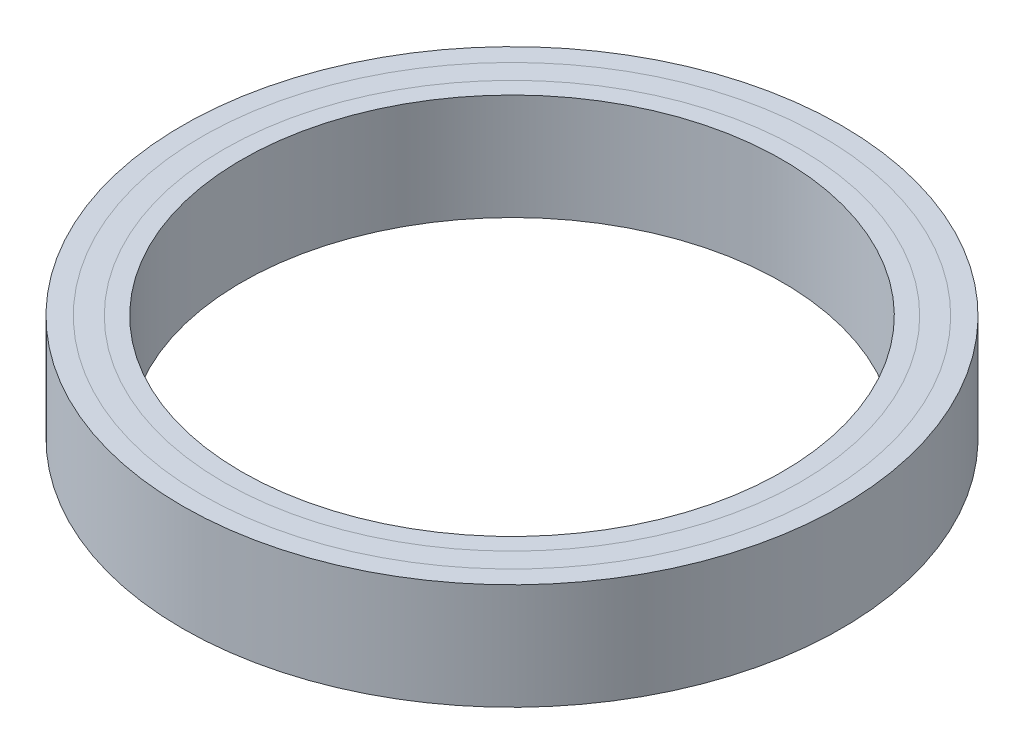
ISO-10303-21;
HEADER;
FILE_DESCRIPTION(('STEP AP214'),'2;1');
FILE_NAME('part.step','',(''),(''),'','','');
FILE_SCHEMA(('AUTOMOTIVE_DESIGN { 1 0 10303 214 1 1 1 1 }'));
ENDSEC;
DATA;
#1=APPLICATION_CONTEXT('core data for automotive mechanical design processes');
#2=APPLICATION_PROTOCOL_DEFINITION('international standard','automotive_design',2000,#1);
#3=PRODUCT_CONTEXT('',#1,'mechanical');
#4=PRODUCT('Part','Part','',(#3));
#5=PRODUCT_RELATED_PRODUCT_CATEGORY('part','',(#4));
#6=PRODUCT_DEFINITION_FORMATION('','',#4);
#7=PRODUCT_DEFINITION_CONTEXT('part definition',#1,'design');
#8=PRODUCT_DEFINITION('design','',#6,#7);
#9=PRODUCT_DEFINITION_SHAPE('','',#8);
#10=(LENGTH_UNIT() NAMED_UNIT(*) SI_UNIT(.MILLI.,.METRE.));
#11=(NAMED_UNIT(*) PLANE_ANGLE_UNIT() SI_UNIT($,.RADIAN.));
#12=(NAMED_UNIT(*) SI_UNIT($,.STERADIAN.) SOLID_ANGLE_UNIT());
#13=UNCERTAINTY_MEASURE_WITH_UNIT(LENGTH_MEASURE(1.E-05),#10,'distance_accuracy_value','');
#14=(GEOMETRIC_REPRESENTATION_CONTEXT(3) GLOBAL_UNCERTAINTY_ASSIGNED_CONTEXT((#13)) GLOBAL_UNIT_ASSIGNED_CONTEXT((#10,
#11,#12)) REPRESENTATION_CONTEXT('',''));
#15=CARTESIAN_POINT('',(0.,0.,0.));
#16=DIRECTION('',(0.,0.,1.));
#17=DIRECTION('',(1.,0.,0.));
#18=AXIS2_PLACEMENT_3D('',#15,#16,#17);
#19=CARTESIAN_POINT('',(0.,3.,0.));
#20=DIRECTION('',(0.,1.,0.));
#21=DIRECTION('',(0.,0.,1.));
#22=AXIS2_PLACEMENT_3D('',#19,#20,#21);
#23=CYLINDRICAL_SURFACE('',#22,23.3898042271142);
#24=CARTESIAN_POINT('',(0.,3.,0.));
#25=DIRECTION('',(0.,1.,0.));
#26=DIRECTION('',(0.,0.,1.));
#27=AXIS2_PLACEMENT_3D('',#24,#25,#26);
#28=CIRCLE('',#27,23.3898042271142);
#29=CARTESIAN_POINT('',(0.,3.,23.3898042271142));
#30=VERTEX_POINT('',#29);
#31=EDGE_CURVE('E11',#30,#30,#28,.T.);
#32=ORIENTED_EDGE('',*,*,#31,.T.);
#33=EDGE_LOOP('',(#32));
#34=FACE_BOUND('',#33,.T.);
#35=CARTESIAN_POINT('',(0.,11.,0.));
#36=DIRECTION('',(0.,1.,0.));
#37=DIRECTION('',(0.,0.,1.));
#38=AXIS2_PLACEMENT_3D('',#35,#36,#37);
#39=CIRCLE('',#38,23.3898042271142);
#40=CARTESIAN_POINT('',(0.,11.,23.3898042271142));
#41=VERTEX_POINT('',#40);
#42=EDGE_CURVE('E51',#41,#41,#39,.T.);
#43=ORIENTED_EDGE('',*,*,#42,.F.);
#44=EDGE_LOOP('',(#43));
#45=FACE_BOUND('',#44,.T.);
#46=ADVANCED_FACE('F48',(#34,#45),#23,.T.);
#47=CARTESIAN_POINT('',(0.,3.,0.));
#48=DIRECTION('',(0.,1.,0.));
#49=DIRECTION('',(0.,0.,1.));
#50=AXIS2_PLACEMENT_3D('',#47,#48,#49);
#51=PLANE('',#50);
#52=CARTESIAN_POINT('',(0.,3.,0.));
#53=DIRECTION('',(0.,1.,0.));
#54=DIRECTION('',(0.,0.,1.));
#55=AXIS2_PLACEMENT_3D('',#52,#53,#54);
#56=CIRCLE('',#55,21.7376476388175);
#57=CARTESIAN_POINT('',(0.,3.,21.7376476388175));
#58=VERTEX_POINT('',#57);
#59=EDGE_CURVE('E58',#58,#58,#56,.T.);
#60=ORIENTED_EDGE('',*,*,#59,.T.);
#61=EDGE_LOOP('',(#60));
#62=FACE_BOUND('',#61,.T.);
#63=ORIENTED_EDGE('',*,*,#31,.F.);
#64=EDGE_LOOP('',(#63));
#65=FACE_BOUND('',#64,.T.);
#66=ADVANCED_FACE('F66',(#62,#65),#51,.F.);
#67=CARTESIAN_POINT('',(0.,11.,0.));
#68=DIRECTION('',(0.,1.,0.));
#69=DIRECTION('',(0.,0.,1.));
#70=AXIS2_PLACEMENT_3D('',#67,#68,#69);
#71=PLANE('',#70);
#72=CARTESIAN_POINT('',(0.,11.,0.));
#73=DIRECTION('',(0.,1.,0.));
#74=DIRECTION('',(0.,0.,1.));
#75=AXIS2_PLACEMENT_3D('',#72,#73,#74);
#76=CIRCLE('',#75,21.7376476388175);
#77=CARTESIAN_POINT('',(0.,11.,21.7376476388175));
#78=VERTEX_POINT('',#77);
#79=EDGE_CURVE('E60',#78,#78,#76,.T.);
#80=ORIENTED_EDGE('',*,*,#79,.F.);
#81=EDGE_LOOP('',(#80));
#82=FACE_BOUND('',#81,.T.);
#83=ORIENTED_EDGE('',*,*,#42,.T.);
#84=EDGE_LOOP('',(#83));
#85=FACE_BOUND('',#84,.T.);
#86=ADVANCED_FACE('F72',(#82,#85),#71,.T.);
#87=CARTESIAN_POINT('',(0.,3.,0.));
#88=DIRECTION('',(0.,1.,0.));
#89=DIRECTION('',(0.,0.,1.));
#90=AXIS2_PLACEMENT_3D('',#87,#88,#89);
#91=CYLINDRICAL_SURFACE('',#90,21.7376476388175);
#92=ORIENTED_EDGE('',*,*,#59,.F.);
#93=EDGE_LOOP('',(#92));
#94=FACE_BOUND('',#93,.T.);
#95=ORIENTED_EDGE('',*,*,#79,.T.);
#96=EDGE_LOOP('',(#95));
#97=FACE_BOUND('',#96,.T.);
#98=ADVANCED_FACE('F69',(#94,#97),#91,.F.);
#99=CLOSED_SHELL('',(#46,#66,#86,#98));
#100=MANIFOLD_SOLID_BREP('B2',#99);
#101=CARTESIAN_POINT('',(0.,11.,0.));
#102=DIRECTION('',(0.,1.,0.));
#103=DIRECTION('',(0.,0.,1.));
#104=AXIS2_PLACEMENT_3D('',#101,#102,#103);
#105=PLANE('',#104);
#106=CARTESIAN_POINT('',(0.,11.,0.));
#107=DIRECTION('',(0.,1.,0.));
#108=DIRECTION('',(0.,0.,1.));
#109=AXIS2_PLACEMENT_3D('',#106,#107,#108);
#110=CIRCLE('',#109,24.8481132807353);
#111=CARTESIAN_POINT('',(0.,11.,24.8481132807353));
#112=VERTEX_POINT('',#111);
#113=EDGE_CURVE('E47',#112,#112,#110,.T.);
#114=ORIENTED_EDGE('',*,*,#113,.T.);
#115=EDGE_LOOP('',(#114));
#116=FACE_BOUND('',#115,.T.);
#117=CARTESIAN_POINT('',(0.,11.,0.));
#118=DIRECTION('',(0.,1.,0.));
#119=DIRECTION('',(0.,0.,1.));
#120=AXIS2_PLACEMENT_3D('',#117,#118,#119);
#121=CIRCLE('',#120,23.3898042271142);
#122=CARTESIAN_POINT('',(0.,11.,23.3898042271142));
#123=VERTEX_POINT('',#122);
#124=EDGE_CURVE('E128',#123,#123,#121,.T.);
#125=ORIENTED_EDGE('',*,*,#124,.F.);
#126=EDGE_LOOP('',(#125));
#127=FACE_BOUND('',#126,.T.);
#128=ADVANCED_FACE('F117',(#116,#127),#105,.T.);
#129=CARTESIAN_POINT('',(0.,3.,0.));
#130=DIRECTION('',(0.,1.,0.));
#131=DIRECTION('',(0.,0.,1.));
#132=AXIS2_PLACEMENT_3D('',#129,#130,#131);
#133=PLANE('',#132);
#134=CARTESIAN_POINT('',(0.,3.,0.));
#135=DIRECTION('',(0.,1.,0.));
#136=DIRECTION('',(0.,0.,1.));
#137=AXIS2_PLACEMENT_3D('',#134,#135,#136);
#138=CIRCLE('',#137,24.8481132807353);
#139=CARTESIAN_POINT('',(0.,3.,24.8481132807353));
#140=VERTEX_POINT('',#139);
#141=EDGE_CURVE('E121',#140,#140,#138,.T.);
#142=ORIENTED_EDGE('',*,*,#141,.F.);
#143=EDGE_LOOP('',(#142));
#144=FACE_BOUND('',#143,.T.);
#145=CARTESIAN_POINT('',(0.,3.,0.));
#146=DIRECTION('',(0.,1.,0.));
#147=DIRECTION('',(0.,0.,1.));
#148=AXIS2_PLACEMENT_3D('',#145,#146,#147);
#149=CIRCLE('',#148,23.3898042271142);
#150=CARTESIAN_POINT('',(0.,3.,23.3898042271142));
#151=VERTEX_POINT('',#150);
#152=EDGE_CURVE('E130',#151,#151,#149,.T.);
#153=ORIENTED_EDGE('',*,*,#152,.T.);
#154=EDGE_LOOP('',(#153));
#155=FACE_BOUND('',#154,.T.);
#156=ADVANCED_FACE('F140',(#144,#155),#133,.F.);
#157=CARTESIAN_POINT('',(0.,11.,0.));
#158=DIRECTION('',(0.,-1.,0.));
#159=DIRECTION('',(0.,0.,-1.));
#160=AXIS2_PLACEMENT_3D('',#157,#158,#159);
#161=CYLINDRICAL_SURFACE('',#160,24.8481132807353);
#162=ORIENTED_EDGE('',*,*,#113,.F.);
#163=EDGE_LOOP('',(#162));
#164=FACE_BOUND('',#163,.T.);
#165=ORIENTED_EDGE('',*,*,#141,.T.);
#166=EDGE_LOOP('',(#165));
#167=FACE_BOUND('',#166,.T.);
#168=ADVANCED_FACE('F119',(#164,#167),#161,.T.);
#169=CARTESIAN_POINT('',(0.,11.,0.));
#170=DIRECTION('',(0.,-1.,0.));
#171=DIRECTION('',(0.,0.,-1.));
#172=AXIS2_PLACEMENT_3D('',#169,#170,#171);
#173=CYLINDRICAL_SURFACE('',#172,23.3898042271142);
#174=ORIENTED_EDGE('',*,*,#124,.T.);
#175=EDGE_LOOP('',(#174));
#176=FACE_BOUND('',#175,.T.);
#177=ORIENTED_EDGE('',*,*,#152,.F.);
#178=EDGE_LOOP('',(#177));
#179=FACE_BOUND('',#178,.T.);
#180=ADVANCED_FACE('F136',(#176,#179),#173,.F.);
#181=CLOSED_SHELL('',(#128,#156,#168,#180));
#182=MANIFOLD_SOLID_BREP('B6',#181);
#183=CARTESIAN_POINT('',(0.,11.,0.));
#184=DIRECTION('',(0.,1.,0.));
#185=DIRECTION('',(0.,0.,1.));
#186=AXIS2_PLACEMENT_3D('',#183,#184,#185);
#187=PLANE('',#186);
#188=CARTESIAN_POINT('',(0.,11.,0.));
#189=DIRECTION('',(0.,1.,0.));
#190=DIRECTION('',(0.,0.,1.));
#191=AXIS2_PLACEMENT_3D('',#188,#189,#190);
#192=CIRCLE('',#191,21.7376476388175);
#193=CARTESIAN_POINT('',(0.,11.,21.7376476388175));
#194=VERTEX_POINT('',#193);
#195=EDGE_CURVE('E116',#194,#194,#192,.T.);
#196=ORIENTED_EDGE('',*,*,#195,.T.);
#197=EDGE_LOOP('',(#196));
#198=FACE_BOUND('',#197,.T.);
#199=CARTESIAN_POINT('',(0.,11.,0.));
#200=DIRECTION('',(0.,1.,0.));
#201=DIRECTION('',(0.,0.,1.));
#202=AXIS2_PLACEMENT_3D('',#199,#200,#201);
#203=CIRCLE('',#202,20.3834697861061);
#204=CARTESIAN_POINT('',(0.,11.,20.3834697861061));
#205=VERTEX_POINT('',#204);
#206=EDGE_CURVE('E190',#205,#205,#203,.T.);
#207=ORIENTED_EDGE('',*,*,#206,.F.);
#208=EDGE_LOOP('',(#207));
#209=FACE_BOUND('',#208,.T.);
#210=ADVANCED_FACE('F179',(#198,#209),#187,.T.);
#211=CARTESIAN_POINT('',(0.,3.,0.));
#212=DIRECTION('',(0.,1.,0.));
#213=DIRECTION('',(0.,0.,1.));
#214=AXIS2_PLACEMENT_3D('',#211,#212,#213);
#215=PLANE('',#214);
#216=CARTESIAN_POINT('',(0.,3.,0.));
#217=DIRECTION('',(0.,1.,0.));
#218=DIRECTION('',(0.,0.,1.));
#219=AXIS2_PLACEMENT_3D('',#216,#217,#218);
#220=CIRCLE('',#219,21.7376476388175);
#221=CARTESIAN_POINT('',(0.,3.,21.7376476388175));
#222=VERTEX_POINT('',#221);
#223=EDGE_CURVE('E183',#222,#222,#220,.T.);
#224=ORIENTED_EDGE('',*,*,#223,.F.);
#225=EDGE_LOOP('',(#224));
#226=FACE_BOUND('',#225,.T.);
#227=CARTESIAN_POINT('',(0.,3.,0.));
#228=DIRECTION('',(0.,1.,0.));
#229=DIRECTION('',(0.,0.,1.));
#230=AXIS2_PLACEMENT_3D('',#227,#228,#229);
#231=CIRCLE('',#230,20.3834697861061);
#232=CARTESIAN_POINT('',(0.,3.,20.3834697861061));
#233=VERTEX_POINT('',#232);
#234=EDGE_CURVE('E192',#233,#233,#231,.T.);
#235=ORIENTED_EDGE('',*,*,#234,.T.);
#236=EDGE_LOOP('',(#235));
#237=FACE_BOUND('',#236,.T.);
#238=ADVANCED_FACE('F202',(#226,#237),#215,.F.);
#239=CARTESIAN_POINT('',(0.,11.,0.));
#240=DIRECTION('',(0.,-1.,0.));
#241=DIRECTION('',(0.,0.,-1.));
#242=AXIS2_PLACEMENT_3D('',#239,#240,#241);
#243=CYLINDRICAL_SURFACE('',#242,21.7376476388175);
#244=ORIENTED_EDGE('',*,*,#195,.F.);
#245=EDGE_LOOP('',(#244));
#246=FACE_BOUND('',#245,.T.);
#247=ORIENTED_EDGE('',*,*,#223,.T.);
#248=EDGE_LOOP('',(#247));
#249=FACE_BOUND('',#248,.T.);
#250=ADVANCED_FACE('F181',(#246,#249),#243,.T.);
#251=CARTESIAN_POINT('',(0.,11.,0.));
#252=DIRECTION('',(0.,-1.,0.));
#253=DIRECTION('',(0.,0.,-1.));
#254=AXIS2_PLACEMENT_3D('',#251,#252,#253);
#255=CYLINDRICAL_SURFACE('',#254,20.3834697861061);
#256=ORIENTED_EDGE('',*,*,#206,.T.);
#257=EDGE_LOOP('',(#256));
#258=FACE_BOUND('',#257,.T.);
#259=ORIENTED_EDGE('',*,*,#234,.F.);
#260=EDGE_LOOP('',(#259));
#261=FACE_BOUND('',#260,.T.);
#262=ADVANCED_FACE('F198',(#258,#261),#255,.F.);
#263=CLOSED_SHELL('',(#210,#238,#250,#262));
#264=MANIFOLD_SOLID_BREP('B42',#263);
#265=ADVANCED_BREP_SHAPE_REPRESENTATION('',(#18,#100,#182,#264),#14);
#266=SHAPE_DEFINITION_REPRESENTATION(#9,#265);
ENDSEC;
END-ISO-10303-21;
